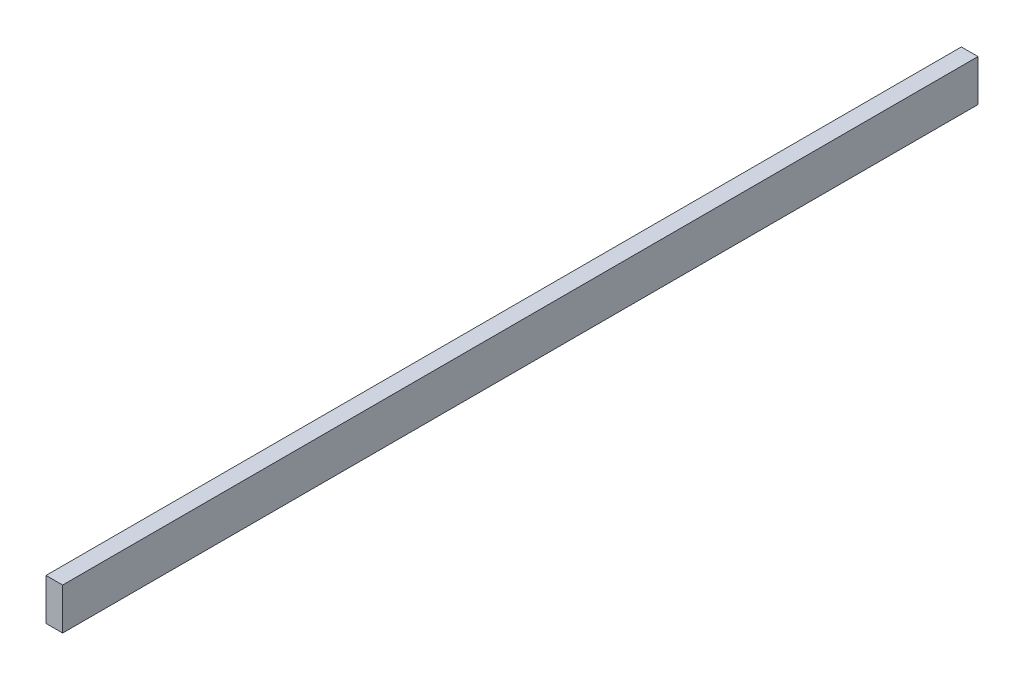
ISO-10303-21;
HEADER;
FILE_DESCRIPTION(('STEP AP214'),'2;1');
FILE_NAME('part.step','',(''),(''),'','','');
FILE_SCHEMA(('AUTOMOTIVE_DESIGN { 1 0 10303 214 1 1 1 1 }'));
ENDSEC;
DATA;
#1=APPLICATION_CONTEXT('core data for automotive mechanical design processes');
#2=APPLICATION_PROTOCOL_DEFINITION('international standard','automotive_design',2000,#1);
#3=PRODUCT_CONTEXT('',#1,'mechanical');
#4=PRODUCT('Part','Part','',(#3));
#5=PRODUCT_RELATED_PRODUCT_CATEGORY('part','',(#4));
#6=PRODUCT_DEFINITION_FORMATION('','',#4);
#7=PRODUCT_DEFINITION_CONTEXT('part definition',#1,'design');
#8=PRODUCT_DEFINITION('design','',#6,#7);
#9=PRODUCT_DEFINITION_SHAPE('','',#8);
#10=(LENGTH_UNIT() NAMED_UNIT(*) SI_UNIT(.MILLI.,.METRE.));
#11=(NAMED_UNIT(*) PLANE_ANGLE_UNIT() SI_UNIT($,.RADIAN.));
#12=(NAMED_UNIT(*) SI_UNIT($,.STERADIAN.) SOLID_ANGLE_UNIT());
#13=UNCERTAINTY_MEASURE_WITH_UNIT(LENGTH_MEASURE(1.E-05),#10,'distance_accuracy_value','');
#14=(GEOMETRIC_REPRESENTATION_CONTEXT(3) GLOBAL_UNCERTAINTY_ASSIGNED_CONTEXT((#13)) GLOBAL_UNIT_ASSIGNED_CONTEXT((#10,
#11,#12)) REPRESENTATION_CONTEXT('',''));
#15=CARTESIAN_POINT('',(0.,0.,0.));
#16=DIRECTION('',(0.,0.,1.));
#17=DIRECTION('',(1.,0.,0.));
#18=AXIS2_PLACEMENT_3D('',#15,#16,#17);
#19=CARTESIAN_POINT('',(10.,0.,0.));
#20=DIRECTION('',(0.,0.,-1.));
#21=DIRECTION('',(-1.,0.,0.));
#22=AXIS2_PLACEMENT_3D('',#19,#20,#21);
#23=PLANE('',#22);
#24=DIRECTION('',(0.,-1.,0.));
#25=VECTOR('',#24,1.);
#26=CARTESIAN_POINT('',(0.,0.,0.));
#27=LINE('',#26,#25);
#28=CARTESIAN_POINT('',(0.,25.,0.));
#29=VERTEX_POINT('',#28);
#30=CARTESIAN_POINT('',(0.,0.,0.));
#31=VERTEX_POINT('',#30);
#32=EDGE_CURVE('E113',#29,#31,#27,.T.);
#33=ORIENTED_EDGE('',*,*,#32,.T.);
#34=DIRECTION('',(-1.,0.,0.));
#35=VECTOR('',#34,1.);
#36=CARTESIAN_POINT('',(10.,0.,0.));
#37=LINE('',#36,#35);
#38=CARTESIAN_POINT('',(10.,0.,0.));
#39=VERTEX_POINT('',#38);
#40=EDGE_CURVE('E11',#39,#31,#37,.T.);
#41=ORIENTED_EDGE('',*,*,#40,.F.);
#42=DIRECTION('',(0.,-1.,0.));
#43=VECTOR('',#42,1.);
#44=CARTESIAN_POINT('',(10.,0.,0.));
#45=LINE('',#44,#43);
#46=CARTESIAN_POINT('',(10.,25.,0.));
#47=VERTEX_POINT('',#46);
#48=EDGE_CURVE('E97',#47,#39,#45,.T.);
#49=ORIENTED_EDGE('',*,*,#48,.F.);
#50=DIRECTION('',(-1.,0.,0.));
#51=VECTOR('',#50,1.);
#52=CARTESIAN_POINT('',(10.,25.,0.));
#53=LINE('',#52,#51);
#54=EDGE_CURVE('E109',#47,#29,#53,.T.);
#55=ORIENTED_EDGE('',*,*,#54,.T.);
#56=EDGE_LOOP('',(#33,#41,#49,#55));
#57=FACE_BOUND('',#56,.T.);
#58=ADVANCED_FACE('F45',(#57),#23,.F.);
#59=CARTESIAN_POINT('',(10.,0.,0.));
#60=DIRECTION('',(0.,1.,0.));
#61=DIRECTION('',(0.,0.,1.));
#62=AXIS2_PLACEMENT_3D('',#59,#60,#61);
#63=PLANE('',#62);
#64=DIRECTION('',(0.,0.,-1.));
#65=VECTOR('',#64,1.);
#66=CARTESIAN_POINT('',(0.,0.,0.));
#67=LINE('',#66,#65);
#68=CARTESIAN_POINT('',(0.,0.,-550.));
#69=VERTEX_POINT('',#68);
#70=EDGE_CURVE('E102',#31,#69,#67,.T.);
#71=ORIENTED_EDGE('',*,*,#70,.T.);
#72=DIRECTION('',(-1.,0.,0.));
#73=VECTOR('',#72,1.);
#74=CARTESIAN_POINT('',(10.,0.,-550.));
#75=LINE('',#74,#73);
#76=CARTESIAN_POINT('',(10.,0.,-550.));
#77=VERTEX_POINT('',#76);
#78=EDGE_CURVE('E54',#77,#69,#75,.T.);
#79=ORIENTED_EDGE('',*,*,#78,.F.);
#80=DIRECTION('',(0.,0.,-1.));
#81=VECTOR('',#80,1.);
#82=CARTESIAN_POINT('',(10.,0.,0.));
#83=LINE('',#82,#81);
#84=EDGE_CURVE('E92',#39,#77,#83,.T.);
#85=ORIENTED_EDGE('',*,*,#84,.F.);
#86=ORIENTED_EDGE('',*,*,#40,.T.);
#87=EDGE_LOOP('',(#71,#79,#85,#86));
#88=FACE_BOUND('',#87,.T.);
#89=ADVANCED_FACE('F101',(#88),#63,.F.);
#90=CARTESIAN_POINT('',(10.,0.,-550.));
#91=DIRECTION('',(0.,0.,1.));
#92=DIRECTION('',(1.,0.,0.));
#93=AXIS2_PLACEMENT_3D('',#90,#91,#92);
#94=PLANE('',#93);
#95=DIRECTION('',(0.,1.,0.));
#96=VECTOR('',#95,1.);
#97=CARTESIAN_POINT('',(0.,0.,-550.));
#98=LINE('',#97,#96);
#99=CARTESIAN_POINT('',(0.,25.,-550.));
#100=VERTEX_POINT('',#99);
#101=EDGE_CURVE('E79',#69,#100,#98,.T.);
#102=ORIENTED_EDGE('',*,*,#101,.T.);
#103=DIRECTION('',(-1.,0.,0.));
#104=VECTOR('',#103,1.);
#105=CARTESIAN_POINT('',(10.,25.,-550.));
#106=LINE('',#105,#104);
#107=CARTESIAN_POINT('',(10.,25.,-550.));
#108=VERTEX_POINT('',#107);
#109=EDGE_CURVE('E104',#108,#100,#106,.T.);
#110=ORIENTED_EDGE('',*,*,#109,.F.);
#111=DIRECTION('',(0.,1.,0.));
#112=VECTOR('',#111,1.);
#113=CARTESIAN_POINT('',(10.,0.,-550.));
#114=LINE('',#113,#112);
#115=EDGE_CURVE('E95',#77,#108,#114,.T.);
#116=ORIENTED_EDGE('',*,*,#115,.F.);
#117=ORIENTED_EDGE('',*,*,#78,.T.);
#118=EDGE_LOOP('',(#102,#110,#116,#117));
#119=FACE_BOUND('',#118,.T.);
#120=ADVANCED_FACE('F105',(#119),#94,.F.);
#121=CARTESIAN_POINT('',(10.,25.,0.));
#122=DIRECTION('',(0.,-1.,0.));
#123=DIRECTION('',(0.,0.,-1.));
#124=AXIS2_PLACEMENT_3D('',#121,#122,#123);
#125=PLANE('',#124);
#126=DIRECTION('',(0.,0.,1.));
#127=VECTOR('',#126,1.);
#128=CARTESIAN_POINT('',(0.,25.,0.));
#129=LINE('',#128,#127);
#130=EDGE_CURVE('E85',#100,#29,#129,.T.);
#131=ORIENTED_EDGE('',*,*,#130,.T.);
#132=ORIENTED_EDGE('',*,*,#54,.F.);
#133=DIRECTION('',(0.,0.,1.));
#134=VECTOR('',#133,1.);
#135=CARTESIAN_POINT('',(10.,25.,0.));
#136=LINE('',#135,#134);
#137=EDGE_CURVE('E62',#108,#47,#136,.T.);
#138=ORIENTED_EDGE('',*,*,#137,.F.);
#139=ORIENTED_EDGE('',*,*,#109,.T.);
#140=EDGE_LOOP('',(#131,#132,#138,#139));
#141=FACE_BOUND('',#140,.T.);
#142=ADVANCED_FACE('F126',(#141),#125,.F.);
#143=CARTESIAN_POINT('',(10.,0.,0.));
#144=DIRECTION('',(-1.,0.,0.));
#145=DIRECTION('',(0.,0.,1.));
#146=AXIS2_PLACEMENT_3D('',#143,#144,#145);
#147=PLANE('',#146);
#148=ORIENTED_EDGE('',*,*,#48,.T.);
#149=ORIENTED_EDGE('',*,*,#84,.T.);
#150=ORIENTED_EDGE('',*,*,#115,.T.);
#151=ORIENTED_EDGE('',*,*,#137,.T.);
#152=EDGE_LOOP('',(#148,#149,#150,#151));
#153=FACE_BOUND('',#152,.T.);
#154=ADVANCED_FACE('F93',(#153),#147,.F.);
#155=CARTESIAN_POINT('',(0.,0.,0.));
#156=DIRECTION('',(-1.,0.,0.));
#157=DIRECTION('',(0.,0.,1.));
#158=AXIS2_PLACEMENT_3D('',#155,#156,#157);
#159=PLANE('',#158);
#160=ORIENTED_EDGE('',*,*,#32,.F.);
#161=ORIENTED_EDGE('',*,*,#130,.F.);
#162=ORIENTED_EDGE('',*,*,#101,.F.);
#163=ORIENTED_EDGE('',*,*,#70,.F.);
#164=EDGE_LOOP('',(#160,#161,#162,#163));
#165=FACE_BOUND('',#164,.T.);
#166=ADVANCED_FACE('F129',(#165),#159,.T.);
#167=CLOSED_SHELL('',(#58,#89,#120,#142,#154,#166));
#168=MANIFOLD_SOLID_BREP('B2',#167);
#169=ADVANCED_BREP_SHAPE_REPRESENTATION('',(#18,#168),#14);
#170=SHAPE_DEFINITION_REPRESENTATION(#9,#169);
ENDSEC;
END-ISO-10303-21;
